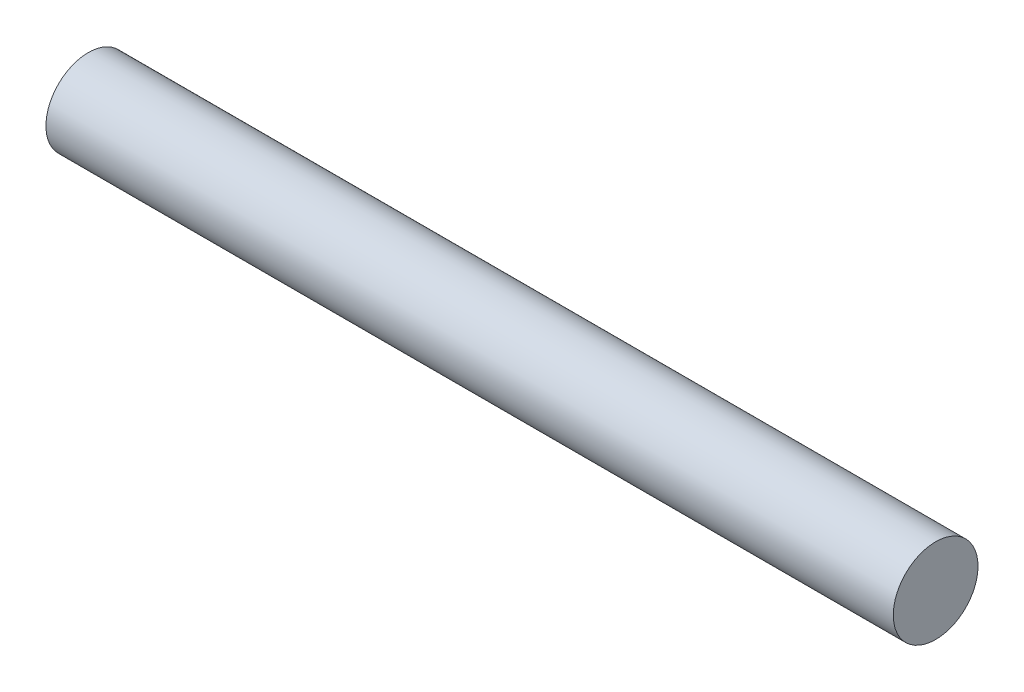
ISO-10303-21;
HEADER;
FILE_DESCRIPTION(('STEP AP214'),'2;1');
FILE_NAME('part.step','',(''),(''),'','','');
FILE_SCHEMA(('AUTOMOTIVE_DESIGN { 1 0 10303 214 1 1 1 1 }'));
ENDSEC;
DATA;
#1=APPLICATION_CONTEXT('core data for automotive mechanical design processes');
#2=APPLICATION_PROTOCOL_DEFINITION('international standard','automotive_design',2000,#1);
#3=PRODUCT_CONTEXT('',#1,'mechanical');
#4=PRODUCT('Part','Part','',(#3));
#5=PRODUCT_RELATED_PRODUCT_CATEGORY('part','',(#4));
#6=PRODUCT_DEFINITION_FORMATION('','',#4);
#7=PRODUCT_DEFINITION_CONTEXT('part definition',#1,'design');
#8=PRODUCT_DEFINITION('design','',#6,#7);
#9=PRODUCT_DEFINITION_SHAPE('','',#8);
#10=(LENGTH_UNIT() NAMED_UNIT(*) SI_UNIT(.MILLI.,.METRE.));
#11=(NAMED_UNIT(*) PLANE_ANGLE_UNIT() SI_UNIT($,.RADIAN.));
#12=(NAMED_UNIT(*) SI_UNIT($,.STERADIAN.) SOLID_ANGLE_UNIT());
#13=UNCERTAINTY_MEASURE_WITH_UNIT(LENGTH_MEASURE(1.E-05),#10,'distance_accuracy_value','');
#14=(GEOMETRIC_REPRESENTATION_CONTEXT(3) GLOBAL_UNCERTAINTY_ASSIGNED_CONTEXT((#13)) GLOBAL_UNIT_ASSIGNED_CONTEXT((#10,
#11,#12)) REPRESENTATION_CONTEXT('',''));
#15=CARTESIAN_POINT('',(0.,0.,0.));
#16=DIRECTION('',(0.,0.,1.));
#17=DIRECTION('',(1.,0.,0.));
#18=AXIS2_PLACEMENT_3D('',#15,#16,#17);
#19=CARTESIAN_POINT('',(254.,0.,0.));
#20=DIRECTION('',(-1.,0.,0.));
#21=DIRECTION('',(0.,0.,1.));
#22=AXIS2_PLACEMENT_3D('',#19,#20,#21);
#23=CYLINDRICAL_SURFACE('',#22,12.7);
#24=CARTESIAN_POINT('',(254.,0.,0.));
#25=DIRECTION('',(1.,0.,0.));
#26=DIRECTION('',(0.,0.,-1.));
#27=AXIS2_PLACEMENT_3D('',#24,#25,#26);
#28=CIRCLE('',#27,12.7);
#29=CARTESIAN_POINT('',(254.,0.,-12.7));
#30=VERTEX_POINT('',#29);
#31=EDGE_CURVE('E10',#30,#30,#28,.T.);
#32=ORIENTED_EDGE('',*,*,#31,.F.);
#33=EDGE_LOOP('',(#32));
#34=FACE_BOUND('',#33,.T.);
#35=CARTESIAN_POINT('',(0.,0.,0.));
#36=DIRECTION('',(1.,0.,0.));
#37=DIRECTION('',(0.,0.,-1.));
#38=AXIS2_PLACEMENT_3D('',#35,#36,#37);
#39=CIRCLE('',#38,12.7);
#40=CARTESIAN_POINT('',(0.,0.,-12.7));
#41=VERTEX_POINT('',#40);
#42=EDGE_CURVE('E34',#41,#41,#39,.T.);
#43=ORIENTED_EDGE('',*,*,#42,.T.);
#44=EDGE_LOOP('',(#43));
#45=FACE_BOUND('',#44,.T.);
#46=ADVANCED_FACE('F31',(#34,#45),#23,.T.);
#47=CARTESIAN_POINT('',(254.,0.,0.));
#48=DIRECTION('',(1.,0.,0.));
#49=DIRECTION('',(0.,0.,-1.));
#50=AXIS2_PLACEMENT_3D('',#47,#48,#49);
#51=PLANE('',#50);
#52=ORIENTED_EDGE('',*,*,#31,.T.);
#53=EDGE_LOOP('',(#52));
#54=FACE_BOUND('',#53,.T.);
#55=ADVANCED_FACE('F46',(#54),#51,.T.);
#56=CARTESIAN_POINT('',(0.,0.,0.));
#57=DIRECTION('',(1.,0.,0.));
#58=DIRECTION('',(0.,0.,-1.));
#59=AXIS2_PLACEMENT_3D('',#56,#57,#58);
#60=PLANE('',#59);
#61=ORIENTED_EDGE('',*,*,#42,.F.);
#62=EDGE_LOOP('',(#61));
#63=FACE_BOUND('',#62,.T.);
#64=ADVANCED_FACE('F44',(#63),#60,.F.);
#65=CLOSED_SHELL('',(#46,#55,#64));
#66=MANIFOLD_SOLID_BREP('B2',#65);
#67=ADVANCED_BREP_SHAPE_REPRESENTATION('',(#18,#66),#14);
#68=SHAPE_DEFINITION_REPRESENTATION(#9,#67);
ENDSEC;
END-ISO-10303-21;
